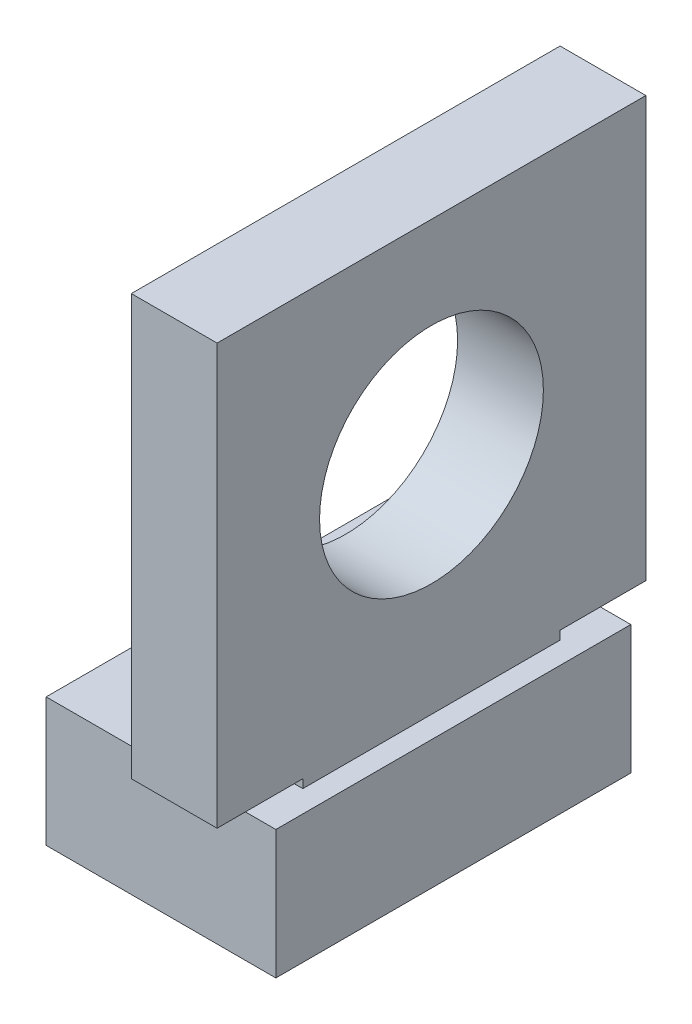
ISO-10303-21;
HEADER;
FILE_DESCRIPTION(('STEP AP214'),'2;1');
FILE_NAME('part.step','',(''),(''),'','','');
FILE_SCHEMA(('AUTOMOTIVE_DESIGN { 1 0 10303 214 1 1 1 1 }'));
ENDSEC;
DATA;
#1=APPLICATION_CONTEXT('core data for automotive mechanical design processes');
#2=APPLICATION_PROTOCOL_DEFINITION('international standard','automotive_design',2000,#1);
#3=PRODUCT_CONTEXT('',#1,'mechanical');
#4=PRODUCT('Part','Part','',(#3));
#5=PRODUCT_RELATED_PRODUCT_CATEGORY('part','',(#4));
#6=PRODUCT_DEFINITION_FORMATION('','',#4);
#7=PRODUCT_DEFINITION_CONTEXT('part definition',#1,'design');
#8=PRODUCT_DEFINITION('design','',#6,#7);
#9=PRODUCT_DEFINITION_SHAPE('','',#8);
#10=(LENGTH_UNIT() NAMED_UNIT(*) SI_UNIT(.MILLI.,.METRE.));
#11=(NAMED_UNIT(*) PLANE_ANGLE_UNIT() SI_UNIT($,.RADIAN.));
#12=(NAMED_UNIT(*) SI_UNIT($,.STERADIAN.) SOLID_ANGLE_UNIT());
#13=UNCERTAINTY_MEASURE_WITH_UNIT(LENGTH_MEASURE(1.E-05),#10,'distance_accuracy_value','');
#14=(GEOMETRIC_REPRESENTATION_CONTEXT(3) GLOBAL_UNCERTAINTY_ASSIGNED_CONTEXT((#13)) GLOBAL_UNIT_ASSIGNED_CONTEXT((#10,
#11,#12)) REPRESENTATION_CONTEXT('',''));
#15=CARTESIAN_POINT('',(0.,0.,0.));
#16=DIRECTION('',(0.,0.,1.));
#17=DIRECTION('',(1.,0.,0.));
#18=AXIS2_PLACEMENT_3D('',#15,#16,#17);
#19=CARTESIAN_POINT('',(5.,96.6227766016838,15.));
#20=DIRECTION('',(0.,0.,-1.));
#21=DIRECTION('',(-1.,0.,0.));
#22=AXIS2_PLACEMENT_3D('',#19,#20,#21);
#23=PLANE('',#22);
#24=DIRECTION('',(1.,0.,0.));
#25=VECTOR('',#24,1.);
#26=CARTESIAN_POINT('',(-5.,16.,15.));
#27=LINE('',#26,#25);
#28=CARTESIAN_POINT('',(-5.,16.,15.));
#29=VERTEX_POINT('',#28);
#30=CARTESIAN_POINT('',(5.,16.,15.));
#31=VERTEX_POINT('',#30);
#32=EDGE_CURVE('E154',#29,#31,#27,.T.);
#33=ORIENTED_EDGE('',*,*,#32,.F.);
#34=DIRECTION('',(0.,-1.,0.));
#35=VECTOR('',#34,1.);
#36=CARTESIAN_POINT('',(-5.,96.6227766016838,15.));
#37=LINE('',#36,#35);
#38=CARTESIAN_POINT('',(-5.,15.,15.));
#39=VERTEX_POINT('',#38);
#40=EDGE_CURVE('E211',#29,#39,#37,.T.);
#41=ORIENTED_EDGE('',*,*,#40,.T.);
#42=DIRECTION('',(1.,0.,0.));
#43=VECTOR('',#42,1.);
#44=CARTESIAN_POINT('',(5.,15.,15.));
#45=LINE('',#44,#43);
#46=CARTESIAN_POINT('',(5.,15.,15.));
#47=VERTEX_POINT('',#46);
#48=EDGE_CURVE('E208',#39,#47,#45,.T.);
#49=ORIENTED_EDGE('',*,*,#48,.T.);
#50=DIRECTION('',(0.,-1.,0.));
#51=VECTOR('',#50,1.);
#52=CARTESIAN_POINT('',(5.,96.6227766016838,15.));
#53=LINE('',#52,#51);
#54=EDGE_CURVE('E207',#31,#47,#53,.T.);
#55=ORIENTED_EDGE('',*,*,#54,.F.);
#56=EDGE_LOOP('',(#33,#41,#49,#55));
#57=FACE_BOUND('',#56,.T.);
#58=ADVANCED_FACE('F40',(#57),#23,.F.);
#59=CARTESIAN_POINT('',(5.,96.6227766016838,-15.));
#60=DIRECTION('',(0.,0.,1.));
#61=DIRECTION('',(1.,0.,0.));
#62=AXIS2_PLACEMENT_3D('',#59,#60,#61);
#63=PLANE('',#62);
#64=DIRECTION('',(-1.,0.,0.));
#65=VECTOR('',#64,1.);
#66=CARTESIAN_POINT('',(5.,16.,-15.));
#67=LINE('',#66,#65);
#68=CARTESIAN_POINT('',(5.,16.,-15.));
#69=VERTEX_POINT('',#68);
#70=CARTESIAN_POINT('',(-5.,16.,-15.));
#71=VERTEX_POINT('',#70);
#72=EDGE_CURVE('E167',#69,#71,#67,.T.);
#73=ORIENTED_EDGE('',*,*,#72,.F.);
#74=DIRECTION('',(0.,-1.,0.));
#75=VECTOR('',#74,1.);
#76=CARTESIAN_POINT('',(5.,96.6227766016838,-15.));
#77=LINE('',#76,#75);
#78=CARTESIAN_POINT('',(5.,15.,-15.));
#79=VERTEX_POINT('',#78);
#80=EDGE_CURVE('E203',#69,#79,#77,.T.);
#81=ORIENTED_EDGE('',*,*,#80,.T.);
#82=DIRECTION('',(-1.,0.,0.));
#83=VECTOR('',#82,1.);
#84=CARTESIAN_POINT('',(5.,15.,-15.));
#85=LINE('',#84,#83);
#86=CARTESIAN_POINT('',(-5.,15.,-15.));
#87=VERTEX_POINT('',#86);
#88=EDGE_CURVE('E200',#79,#87,#85,.T.);
#89=ORIENTED_EDGE('',*,*,#88,.T.);
#90=DIRECTION('',(0.,-1.,0.));
#91=VECTOR('',#90,1.);
#92=CARTESIAN_POINT('',(-5.,96.6227766016838,-15.));
#93=LINE('',#92,#91);
#94=EDGE_CURVE('E194',#71,#87,#93,.T.);
#95=ORIENTED_EDGE('',*,*,#94,.F.);
#96=EDGE_LOOP('',(#73,#81,#89,#95));
#97=FACE_BOUND('',#96,.T.);
#98=ADVANCED_FACE('F241',(#97),#63,.F.);
#99=CARTESIAN_POINT('',(0.,15.,0.));
#100=DIRECTION('',(0.,1.,0.));
#101=DIRECTION('',(0.,0.,1.));
#102=AXIS2_PLACEMENT_3D('',#99,#100,#101);
#103=PLANE('',#102);
#104=ORIENTED_EDGE('',*,*,#48,.F.);
#105=DIRECTION('',(0.,0.,1.));
#106=VECTOR('',#105,1.);
#107=CARTESIAN_POINT('',(-5.,15.,-15.));
#108=LINE('',#107,#106);
#109=EDGE_CURVE('E212',#87,#39,#108,.T.);
#110=ORIENTED_EDGE('',*,*,#109,.F.);
#111=ORIENTED_EDGE('',*,*,#88,.F.);
#112=DIRECTION('',(0.,0.,-1.));
#113=VECTOR('',#112,1.);
#114=CARTESIAN_POINT('',(5.,15.,-15.));
#115=LINE('',#114,#113);
#116=EDGE_CURVE('E204',#47,#79,#115,.T.);
#117=ORIENTED_EDGE('',*,*,#116,.F.);
#118=EDGE_LOOP('',(#104,#110,#111,#117));
#119=FACE_BOUND('',#118,.T.);
#120=DIRECTION('',(1.,0.,0.));
#121=VECTOR('',#120,1.);
#122=CARTESIAN_POINT('',(7.55009933801887,15.,20.6977631671492));
#123=LINE('',#122,#121);
#124=CARTESIAN_POINT('',(-19.2345280916938,15.,20.6977631671493));
#125=VERTEX_POINT('',#124);
#126=CARTESIAN_POINT('',(7.55009933801887,15.,20.6977631671492));
#127=VERTEX_POINT('',#126);
#128=EDGE_CURVE('E189',#125,#127,#123,.T.);
#129=ORIENTED_EDGE('',*,*,#128,.T.);
#130=DIRECTION('',(0.,0.,-1.));
#131=VECTOR('',#130,1.);
#132=CARTESIAN_POINT('',(7.55009933801887,15.,-20.6977631671492));
#133=LINE('',#132,#131);
#134=CARTESIAN_POINT('',(7.55009933801887,15.,-20.6977631671492));
#135=VERTEX_POINT('',#134);
#136=EDGE_CURVE('E182',#127,#135,#133,.T.);
#137=ORIENTED_EDGE('',*,*,#136,.T.);
#138=DIRECTION('',(-1.,0.,0.));
#139=VECTOR('',#138,1.);
#140=CARTESIAN_POINT('',(-19.2345280916939,15.,-20.6977631671492));
#141=LINE('',#140,#139);
#142=CARTESIAN_POINT('',(-19.2345280916939,15.,-20.6977631671492));
#143=VERTEX_POINT('',#142);
#144=EDGE_CURVE('E185',#135,#143,#141,.T.);
#145=ORIENTED_EDGE('',*,*,#144,.T.);
#146=DIRECTION('',(0.,0.,1.));
#147=VECTOR('',#146,1.);
#148=CARTESIAN_POINT('',(-19.2345280916939,15.,-20.6977631671492));
#149=LINE('',#148,#147);
#150=EDGE_CURVE('E55',#143,#125,#149,.T.);
#151=ORIENTED_EDGE('',*,*,#150,.T.);
#152=EDGE_LOOP('',(#129,#137,#145,#151));
#153=FACE_BOUND('',#152,.T.);
#154=ADVANCED_FACE('F238',(#119,#153),#103,.T.);
#155=CARTESIAN_POINT('',(-5.,96.6227766016838,-15.));
#156=DIRECTION('',(1.,0.,0.));
#157=DIRECTION('',(0.,0.,-1.));
#158=AXIS2_PLACEMENT_3D('',#155,#156,#157);
#159=PLANE('',#158);
#160=CARTESIAN_POINT('',(-5.,41.2362408693073,0.));
#161=DIRECTION('',(1.,0.,0.));
#162=DIRECTION('',(0.,0.,-1.));
#163=AXIS2_PLACEMENT_3D('',#160,#161,#162);
#164=CIRCLE('',#163,13.05);
#165=CARTESIAN_POINT('',(-5.,41.2362408693073,-13.05));
#166=VERTEX_POINT('',#165);
#167=EDGE_CURVE('E156',#166,#166,#164,.T.);
#168=ORIENTED_EDGE('',*,*,#167,.T.);
#169=EDGE_LOOP('',(#168));
#170=FACE_BOUND('',#169,.T.);
#171=DIRECTION('',(0.,0.,1.));
#172=VECTOR('',#171,1.);
#173=CARTESIAN_POINT('',(-5.,65.,-15.));
#174=LINE('',#173,#172);
#175=CARTESIAN_POINT('',(-5.,65.,-25.));
#176=VERTEX_POINT('',#175);
#177=CARTESIAN_POINT('',(-5.,65.,25.));
#178=VERTEX_POINT('',#177);
#179=EDGE_CURVE('E141',#176,#178,#174,.T.);
#180=ORIENTED_EDGE('',*,*,#179,.F.);
#181=DIRECTION('',(0.,1.,0.));
#182=VECTOR('',#181,1.);
#183=CARTESIAN_POINT('',(-5.,16.,-25.));
#184=LINE('',#183,#182);
#185=CARTESIAN_POINT('',(-5.,16.,-25.));
#186=VERTEX_POINT('',#185);
#187=EDGE_CURVE('E168',#186,#176,#184,.T.);
#188=ORIENTED_EDGE('',*,*,#187,.F.);
#189=DIRECTION('',(0.,0.,1.));
#190=VECTOR('',#189,1.);
#191=CARTESIAN_POINT('',(-5.,16.,-25.));
#192=LINE('',#191,#190);
#193=EDGE_CURVE('E176',#186,#71,#192,.T.);
#194=ORIENTED_EDGE('',*,*,#193,.T.);
#195=ORIENTED_EDGE('',*,*,#94,.T.);
#196=ORIENTED_EDGE('',*,*,#109,.T.);
#197=ORIENTED_EDGE('',*,*,#40,.F.);
#198=DIRECTION('',(0.,0.,-1.));
#199=VECTOR('',#198,1.);
#200=CARTESIAN_POINT('',(-5.,16.,25.));
#201=LINE('',#200,#199);
#202=CARTESIAN_POINT('',(-5.,16.,25.));
#203=VERTEX_POINT('',#202);
#204=EDGE_CURVE('E165',#203,#29,#201,.T.);
#205=ORIENTED_EDGE('',*,*,#204,.F.);
#206=DIRECTION('',(0.,-1.,0.));
#207=VECTOR('',#206,1.);
#208=CARTESIAN_POINT('',(-5.,65.,25.));
#209=LINE('',#208,#207);
#210=EDGE_CURVE('E148',#178,#203,#209,.T.);
#211=ORIENTED_EDGE('',*,*,#210,.F.);
#212=EDGE_LOOP('',(#180,#188,#194,#195,#196,#197,#205,#211));
#213=FACE_BOUND('',#212,.T.);
#214=ADVANCED_FACE('F240',(#170,#213),#159,.F.);
#215=CARTESIAN_POINT('',(5.,96.6227766016838,-15.));
#216=DIRECTION('',(-1.,0.,0.));
#217=DIRECTION('',(0.,0.,1.));
#218=AXIS2_PLACEMENT_3D('',#215,#216,#217);
#219=PLANE('',#218);
#220=CARTESIAN_POINT('',(5.,41.2362408693073,0.));
#221=DIRECTION('',(1.,0.,0.));
#222=DIRECTION('',(0.,0.,-1.));
#223=AXIS2_PLACEMENT_3D('',#220,#221,#222);
#224=CIRCLE('',#223,13.05);
#225=CARTESIAN_POINT('',(5.,41.2362408693073,-13.05));
#226=VERTEX_POINT('',#225);
#227=EDGE_CURVE('E271',#226,#226,#224,.T.);
#228=ORIENTED_EDGE('',*,*,#227,.F.);
#229=EDGE_LOOP('',(#228));
#230=FACE_BOUND('',#229,.T.);
#231=DIRECTION('',(0.,0.,-1.));
#232=VECTOR('',#231,1.);
#233=CARTESIAN_POINT('',(5.,65.,-15.));
#234=LINE('',#233,#232);
#235=CARTESIAN_POINT('',(5.,65.,25.));
#236=VERTEX_POINT('',#235);
#237=CARTESIAN_POINT('',(5.,65.,-25.));
#238=VERTEX_POINT('',#237);
#239=EDGE_CURVE('E129',#236,#238,#234,.T.);
#240=ORIENTED_EDGE('',*,*,#239,.F.);
#241=DIRECTION('',(0.,1.,0.));
#242=VECTOR('',#241,1.);
#243=CARTESIAN_POINT('',(5.,16.,25.));
#244=LINE('',#243,#242);
#245=CARTESIAN_POINT('',(5.,16.,25.));
#246=VERTEX_POINT('',#245);
#247=EDGE_CURVE('E134',#246,#236,#244,.T.);
#248=ORIENTED_EDGE('',*,*,#247,.F.);
#249=DIRECTION('',(0.,0.,-1.));
#250=VECTOR('',#249,1.);
#251=CARTESIAN_POINT('',(5.,16.,25.));
#252=LINE('',#251,#250);
#253=EDGE_CURVE('E162',#246,#31,#252,.T.);
#254=ORIENTED_EDGE('',*,*,#253,.T.);
#255=ORIENTED_EDGE('',*,*,#54,.T.);
#256=ORIENTED_EDGE('',*,*,#116,.T.);
#257=ORIENTED_EDGE('',*,*,#80,.F.);
#258=DIRECTION('',(0.,0.,1.));
#259=VECTOR('',#258,1.);
#260=CARTESIAN_POINT('',(5.,16.,-25.));
#261=LINE('',#260,#259);
#262=CARTESIAN_POINT('',(5.,16.,-25.));
#263=VERTEX_POINT('',#262);
#264=EDGE_CURVE('E180',#263,#69,#261,.T.);
#265=ORIENTED_EDGE('',*,*,#264,.F.);
#266=DIRECTION('',(0.,-1.,0.));
#267=VECTOR('',#266,1.);
#268=CARTESIAN_POINT('',(5.,65.,-25.));
#269=LINE('',#268,#267);
#270=EDGE_CURVE('E136',#238,#263,#269,.T.);
#271=ORIENTED_EDGE('',*,*,#270,.F.);
#272=EDGE_LOOP('',(#240,#248,#254,#255,#256,#257,#265,#271));
#273=FACE_BOUND('',#272,.T.);
#274=ADVANCED_FACE('F131',(#230,#273),#219,.F.);
#275=CARTESIAN_POINT('',(-100.,65.,45.));
#276=DIRECTION('',(0.,1.,0.));
#277=DIRECTION('',(0.,0.,1.));
#278=AXIS2_PLACEMENT_3D('',#275,#276,#277);
#279=PLANE('',#278);
#280=ORIENTED_EDGE('',*,*,#239,.T.);
#281=DIRECTION('',(1.,0.,0.));
#282=VECTOR('',#281,1.);
#283=CARTESIAN_POINT('',(-5.,65.,-25.));
#284=LINE('',#283,#282);
#285=EDGE_CURVE('E171',#176,#238,#284,.T.);
#286=ORIENTED_EDGE('',*,*,#285,.F.);
#287=ORIENTED_EDGE('',*,*,#179,.T.);
#288=DIRECTION('',(-1.,0.,0.));
#289=VECTOR('',#288,1.);
#290=CARTESIAN_POINT('',(5.,65.,25.));
#291=LINE('',#290,#289);
#292=EDGE_CURVE('E144',#236,#178,#291,.T.);
#293=ORIENTED_EDGE('',*,*,#292,.F.);
#294=EDGE_LOOP('',(#280,#286,#287,#293));
#295=FACE_BOUND('',#294,.T.);
#296=ADVANCED_FACE('F145',(#295),#279,.T.);
#297=CARTESIAN_POINT('',(7.55009933801887,-12.,-20.6977631671492));
#298=DIRECTION('',(1.,0.,0.));
#299=DIRECTION('',(0.,0.,-1.));
#300=AXIS2_PLACEMENT_3D('',#297,#298,#299);
#301=PLANE('',#300);
#302=DIRECTION('',(0.,0.,-1.));
#303=VECTOR('',#302,1.);
#304=CARTESIAN_POINT('',(7.55009933801887,0.,0.));
#305=LINE('',#304,#303);
#306=CARTESIAN_POINT('',(7.55009933801887,0.,20.6977631671492));
#307=VERTEX_POINT('',#306);
#308=CARTESIAN_POINT('',(7.55009933801887,0.,-20.6977631671492));
#309=VERTEX_POINT('',#308);
#310=EDGE_CURVE('E11',#307,#309,#305,.T.);
#311=ORIENTED_EDGE('',*,*,#310,.T.);
#312=DIRECTION('',(0.,1.,0.));
#313=VECTOR('',#312,1.);
#314=CARTESIAN_POINT('',(7.55009933801887,-12.,-20.6977631671492));
#315=LINE('',#314,#313);
#316=EDGE_CURVE('E63',#309,#135,#315,.T.);
#317=ORIENTED_EDGE('',*,*,#316,.T.);
#318=ORIENTED_EDGE('',*,*,#136,.F.);
#319=DIRECTION('',(0.,1.,0.));
#320=VECTOR('',#319,1.);
#321=CARTESIAN_POINT('',(7.55009933801887,-12.,20.6977631671492));
#322=LINE('',#321,#320);
#323=EDGE_CURVE('E192',#307,#127,#322,.T.);
#324=ORIENTED_EDGE('',*,*,#323,.F.);
#325=EDGE_LOOP('',(#311,#317,#318,#324));
#326=FACE_BOUND('',#325,.T.);
#327=ADVANCED_FACE('F233',(#326),#301,.T.);
#328=CARTESIAN_POINT('',(7.55009933801887,-12.,20.6977631671492));
#329=DIRECTION('',(0.,0.,1.));
#330=DIRECTION('',(1.,0.,0.));
#331=AXIS2_PLACEMENT_3D('',#328,#329,#330);
#332=PLANE('',#331);
#333=DIRECTION('',(1.,0.,0.));
#334=VECTOR('',#333,1.);
#335=CARTESIAN_POINT('',(0.,0.,20.6977631671492));
#336=LINE('',#335,#334);
#337=CARTESIAN_POINT('',(-19.2345280916938,0.,20.6977631671493));
#338=VERTEX_POINT('',#337);
#339=EDGE_CURVE('E48',#338,#307,#336,.T.);
#340=ORIENTED_EDGE('',*,*,#339,.T.);
#341=ORIENTED_EDGE('',*,*,#323,.T.);
#342=ORIENTED_EDGE('',*,*,#128,.F.);
#343=DIRECTION('',(0.,1.,0.));
#344=VECTOR('',#343,1.);
#345=CARTESIAN_POINT('',(-19.2345280916938,-12.,20.6977631671493));
#346=LINE('',#345,#344);
#347=EDGE_CURVE('E195',#338,#125,#346,.T.);
#348=ORIENTED_EDGE('',*,*,#347,.F.);
#349=EDGE_LOOP('',(#340,#341,#342,#348));
#350=FACE_BOUND('',#349,.T.);
#351=ADVANCED_FACE('F226',(#350),#332,.T.);
#352=CARTESIAN_POINT('',(-19.2345280916939,-12.,-20.6977631671492));
#353=DIRECTION('',(-1.,0.,0.));
#354=DIRECTION('',(0.,0.,1.));
#355=AXIS2_PLACEMENT_3D('',#352,#353,#354);
#356=PLANE('',#355);
#357=DIRECTION('',(0.,0.,1.));
#358=VECTOR('',#357,1.);
#359=CARTESIAN_POINT('',(-19.2345280916939,0.,0.));
#360=LINE('',#359,#358);
#361=CARTESIAN_POINT('',(-19.2345280916939,0.,-20.6977631671492));
#362=VERTEX_POINT('',#361);
#363=EDGE_CURVE('E221',#362,#338,#360,.T.);
#364=ORIENTED_EDGE('',*,*,#363,.T.);
#365=ORIENTED_EDGE('',*,*,#347,.T.);
#366=ORIENTED_EDGE('',*,*,#150,.F.);
#367=DIRECTION('',(0.,1.,0.));
#368=VECTOR('',#367,1.);
#369=CARTESIAN_POINT('',(-19.2345280916939,-12.,-20.6977631671492));
#370=LINE('',#369,#368);
#371=EDGE_CURVE('E197',#362,#143,#370,.T.);
#372=ORIENTED_EDGE('',*,*,#371,.F.);
#373=EDGE_LOOP('',(#364,#365,#366,#372));
#374=FACE_BOUND('',#373,.T.);
#375=ADVANCED_FACE('F236',(#374),#356,.T.);
#376=CARTESIAN_POINT('',(-19.2345280916939,-12.,-20.6977631671492));
#377=DIRECTION('',(0.,0.,-1.));
#378=DIRECTION('',(-1.,0.,0.));
#379=AXIS2_PLACEMENT_3D('',#376,#377,#378);
#380=PLANE('',#379);
#381=DIRECTION('',(-1.,0.,0.));
#382=VECTOR('',#381,1.);
#383=CARTESIAN_POINT('',(0.,0.,-20.6977631671492));
#384=LINE('',#383,#382);
#385=EDGE_CURVE('E140',#309,#362,#384,.T.);
#386=ORIENTED_EDGE('',*,*,#385,.T.);
#387=ORIENTED_EDGE('',*,*,#371,.T.);
#388=ORIENTED_EDGE('',*,*,#144,.F.);
#389=ORIENTED_EDGE('',*,*,#316,.F.);
#390=EDGE_LOOP('',(#386,#387,#388,#389));
#391=FACE_BOUND('',#390,.T.);
#392=ADVANCED_FACE('F235',(#391),#380,.T.);
#393=CARTESIAN_POINT('',(0.,0.,0.));
#394=DIRECTION('',(0.,1.,0.));
#395=DIRECTION('',(0.,0.,1.));
#396=AXIS2_PLACEMENT_3D('',#393,#394,#395);
#397=PLANE('',#396);
#398=ORIENTED_EDGE('',*,*,#310,.F.);
#399=ORIENTED_EDGE('',*,*,#339,.F.);
#400=ORIENTED_EDGE('',*,*,#363,.F.);
#401=ORIENTED_EDGE('',*,*,#385,.F.);
#402=EDGE_LOOP('',(#398,#399,#400,#401));
#403=FACE_BOUND('',#402,.T.);
#404=ADVANCED_FACE('F42',(#403),#397,.F.);
#405=CARTESIAN_POINT('',(5.,16.,-25.));
#406=DIRECTION('',(0.,1.,0.));
#407=DIRECTION('',(0.,0.,1.));
#408=AXIS2_PLACEMENT_3D('',#405,#406,#407);
#409=PLANE('',#408);
#410=ORIENTED_EDGE('',*,*,#72,.T.);
#411=ORIENTED_EDGE('',*,*,#193,.F.);
#412=DIRECTION('',(-1.,0.,0.));
#413=VECTOR('',#412,1.);
#414=CARTESIAN_POINT('',(5.,16.,-25.));
#415=LINE('',#414,#413);
#416=EDGE_CURVE('E174',#263,#186,#415,.T.);
#417=ORIENTED_EDGE('',*,*,#416,.F.);
#418=ORIENTED_EDGE('',*,*,#264,.T.);
#419=EDGE_LOOP('',(#410,#411,#417,#418));
#420=FACE_BOUND('',#419,.T.);
#421=ADVANCED_FACE('F292',(#420),#409,.F.);
#422=CARTESIAN_POINT('',(0.,0.,-25.));
#423=DIRECTION('',(0.,0.,-1.));
#424=DIRECTION('',(-1.,0.,0.));
#425=AXIS2_PLACEMENT_3D('',#422,#423,#424);
#426=PLANE('',#425);
#427=ORIENTED_EDGE('',*,*,#187,.T.);
#428=ORIENTED_EDGE('',*,*,#285,.T.);
#429=ORIENTED_EDGE('',*,*,#270,.T.);
#430=ORIENTED_EDGE('',*,*,#416,.T.);
#431=EDGE_LOOP('',(#427,#428,#429,#430));
#432=FACE_BOUND('',#431,.T.);
#433=ADVANCED_FACE('F288',(#432),#426,.T.);
#434=CARTESIAN_POINT('',(-5.,16.,25.));
#435=DIRECTION('',(0.,1.,0.));
#436=DIRECTION('',(0.,0.,1.));
#437=AXIS2_PLACEMENT_3D('',#434,#435,#436);
#438=PLANE('',#437);
#439=ORIENTED_EDGE('',*,*,#32,.T.);
#440=ORIENTED_EDGE('',*,*,#253,.F.);
#441=DIRECTION('',(1.,0.,0.));
#442=VECTOR('',#441,1.);
#443=CARTESIAN_POINT('',(-5.,16.,25.));
#444=LINE('',#443,#442);
#445=EDGE_CURVE('E152',#203,#246,#444,.T.);
#446=ORIENTED_EDGE('',*,*,#445,.F.);
#447=ORIENTED_EDGE('',*,*,#204,.T.);
#448=EDGE_LOOP('',(#439,#440,#446,#447));
#449=FACE_BOUND('',#448,.T.);
#450=ADVANCED_FACE('F283',(#449),#438,.F.);
#451=CARTESIAN_POINT('',(0.,0.,25.));
#452=DIRECTION('',(0.,0.,1.));
#453=DIRECTION('',(1.,0.,0.));
#454=AXIS2_PLACEMENT_3D('',#451,#452,#453);
#455=PLANE('',#454);
#456=ORIENTED_EDGE('',*,*,#247,.T.);
#457=ORIENTED_EDGE('',*,*,#292,.T.);
#458=ORIENTED_EDGE('',*,*,#210,.T.);
#459=ORIENTED_EDGE('',*,*,#445,.T.);
#460=EDGE_LOOP('',(#456,#457,#458,#459));
#461=FACE_BOUND('',#460,.T.);
#462=ADVANCED_FACE('F150',(#461),#455,.T.);
#463=CARTESIAN_POINT('',(-19.2345280916939,41.2362408693073,0.));
#464=DIRECTION('',(1.,0.,0.));
#465=DIRECTION('',(0.,0.,-1.));
#466=AXIS2_PLACEMENT_3D('',#463,#464,#465);
#467=CYLINDRICAL_SURFACE('',#466,13.05);
#468=ORIENTED_EDGE('',*,*,#227,.T.);
#469=EDGE_LOOP('',(#468));
#470=FACE_BOUND('',#469,.T.);
#471=ORIENTED_EDGE('',*,*,#167,.F.);
#472=EDGE_LOOP('',(#471));
#473=FACE_BOUND('',#472,.T.);
#474=ADVANCED_FACE('F277',(#470,#473),#467,.F.);
#475=CLOSED_SHELL('',(#58,#98,#154,#214,#274,#296,#327,#351,#375,#392,#404,#421,#433,#450,#462,#474));
#476=MANIFOLD_SOLID_BREP('B2',#475);
#477=ADVANCED_BREP_SHAPE_REPRESENTATION('',(#18,#476),#14);
#478=SHAPE_DEFINITION_REPRESENTATION(#9,#477);
ENDSEC;
END-ISO-10303-21;
